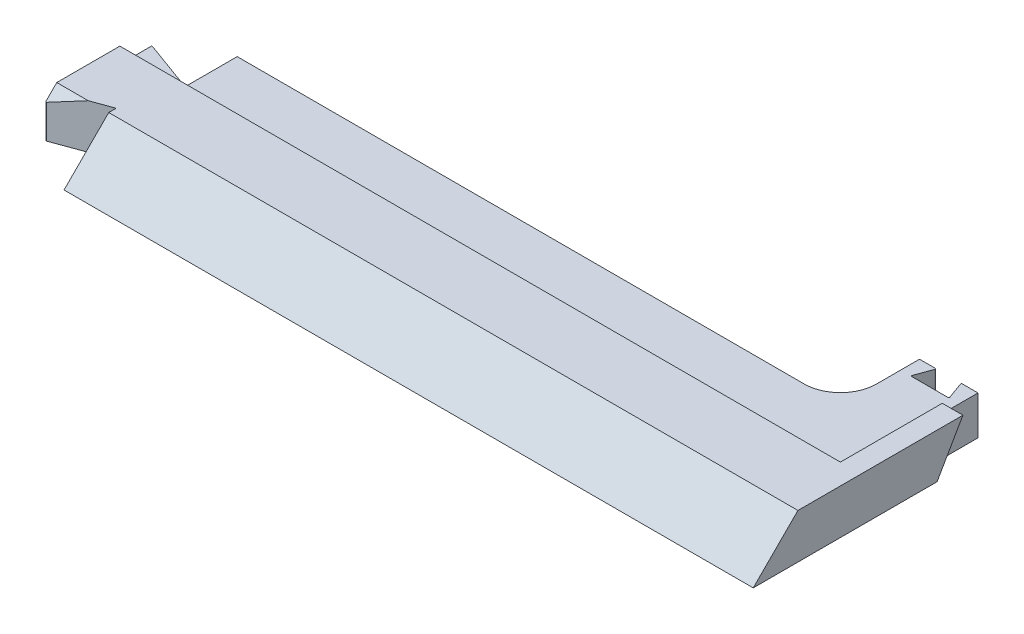
ISO-10303-21;
HEADER;
FILE_DESCRIPTION(('STEP AP214'),'2;1');
FILE_NAME('part.step','',(''),(''),'','','');
FILE_SCHEMA(('AUTOMOTIVE_DESIGN { 1 0 10303 214 1 1 1 1 }'));
ENDSEC;
DATA;
#1=APPLICATION_CONTEXT('core data for automotive mechanical design processes');
#2=APPLICATION_PROTOCOL_DEFINITION('international standard','automotive_design',2000,#1);
#3=PRODUCT_CONTEXT('',#1,'mechanical');
#4=PRODUCT('Part','Part','',(#3));
#5=PRODUCT_RELATED_PRODUCT_CATEGORY('part','',(#4));
#6=PRODUCT_DEFINITION_FORMATION('','',#4);
#7=PRODUCT_DEFINITION_CONTEXT('part definition',#1,'design');
#8=PRODUCT_DEFINITION('design','',#6,#7);
#9=PRODUCT_DEFINITION_SHAPE('','',#8);
#10=(LENGTH_UNIT() NAMED_UNIT(*) SI_UNIT(.MILLI.,.METRE.));
#11=(NAMED_UNIT(*) PLANE_ANGLE_UNIT() SI_UNIT($,.RADIAN.));
#12=(NAMED_UNIT(*) SI_UNIT($,.STERADIAN.) SOLID_ANGLE_UNIT());
#13=UNCERTAINTY_MEASURE_WITH_UNIT(LENGTH_MEASURE(1.E-05),#10,'distance_accuracy_value','');
#14=(GEOMETRIC_REPRESENTATION_CONTEXT(3) GLOBAL_UNCERTAINTY_ASSIGNED_CONTEXT((#13)) GLOBAL_UNIT_ASSIGNED_CONTEXT((#10,
#11,#12)) REPRESENTATION_CONTEXT('',''));
#15=CARTESIAN_POINT('',(0.,0.,0.));
#16=DIRECTION('',(0.,0.,1.));
#17=DIRECTION('',(1.,0.,0.));
#18=AXIS2_PLACEMENT_3D('',#15,#16,#17);
#19=CARTESIAN_POINT('',(-192.3375,0.,0.));
#20=DIRECTION('',(-1.,0.,0.));
#21=DIRECTION('',(0.,0.,1.));
#22=AXIS2_PLACEMENT_3D('',#19,#20,#21);
#23=PLANE('',#22);
#24=DIRECTION('',(0.,0.,1.));
#25=VECTOR('',#24,1.);
#26=CARTESIAN_POINT('',(-192.3375,0.,-330.275));
#27=LINE('',#26,#25);
#28=CARTESIAN_POINT('',(-192.3375,0.,-17.));
#29=VERTEX_POINT('',#28);
#30=CARTESIAN_POINT('',(-192.3375,0.,-2.11687960134838));
#31=VERTEX_POINT('',#30);
#32=EDGE_CURVE('E451',#29,#31,#27,.T.);
#33=ORIENTED_EDGE('',*,*,#32,.T.);
#34=DIRECTION('',(0.,1.,0.));
#35=VECTOR('',#34,1.);
#36=CARTESIAN_POINT('',(-192.3375,11.31,-2.1168796013484));
#37=LINE('',#36,#35);
#38=CARTESIAN_POINT('',(-192.3375,11.31,-2.11687960134838));
#39=VERTEX_POINT('',#38);
#40=EDGE_CURVE('E513',#31,#39,#37,.T.);
#41=ORIENTED_EDGE('',*,*,#40,.T.);
#42=DIRECTION('',(0.,0.,1.));
#43=VECTOR('',#42,1.);
#44=CARTESIAN_POINT('',(-192.3375,11.31,-330.275));
#45=LINE('',#44,#43);
#46=CARTESIAN_POINT('',(-192.3375,11.31,-17.));
#47=VERTEX_POINT('',#46);
#48=EDGE_CURVE('E328',#47,#39,#45,.T.);
#49=ORIENTED_EDGE('',*,*,#48,.F.);
#50=DIRECTION('',(0.,1.,0.));
#51=VECTOR('',#50,1.);
#52=CARTESIAN_POINT('',(-192.3375,2.9,-17.));
#53=LINE('',#52,#51);
#54=EDGE_CURVE('E323',#29,#47,#53,.T.);
#55=ORIENTED_EDGE('',*,*,#54,.F.);
#56=EDGE_LOOP('',(#33,#41,#49,#55));
#57=FACE_BOUND('',#56,.T.);
#58=ADVANCED_FACE('F46',(#57),#23,.T.);
#59=CARTESIAN_POINT('',(0.,0.,-40.));
#60=DIRECTION('',(0.,0.,1.));
#61=DIRECTION('',(1.,0.,0.));
#62=AXIS2_PLACEMENT_3D('',#59,#60,#61);
#63=PLANE('',#62);
#64=DIRECTION('',(1.,0.,0.));
#65=VECTOR('',#64,1.);
#66=CARTESIAN_POINT('',(-357.675,0.,-40.));
#67=LINE('',#66,#65);
#68=CARTESIAN_POINT('',(-4.61437039865159,0.,-40.));
#69=VERTEX_POINT('',#68);
#70=CARTESIAN_POINT('',(0.,0.,-40.));
#71=VERTEX_POINT('',#70);
#72=EDGE_CURVE('E327',#69,#71,#67,.T.);
#73=ORIENTED_EDGE('',*,*,#72,.F.);
#74=DIRECTION('',(0.,1.,0.));
#75=VECTOR('',#74,1.);
#76=CARTESIAN_POINT('',(-4.61437039865159,0.,-40.));
#77=LINE('',#76,#75);
#78=CARTESIAN_POINT('',(-4.61437039865159,11.31,-40.));
#79=VERTEX_POINT('',#78);
#80=EDGE_CURVE('E471',#69,#79,#77,.T.);
#81=ORIENTED_EDGE('',*,*,#80,.T.);
#82=DIRECTION('',(1.,0.,0.));
#83=VECTOR('',#82,1.);
#84=CARTESIAN_POINT('',(-357.675,11.31,-40.));
#85=LINE('',#84,#83);
#86=CARTESIAN_POINT('',(0.,11.31,-40.));
#87=VERTEX_POINT('',#86);
#88=EDGE_CURVE('E317',#79,#87,#85,.T.);
#89=ORIENTED_EDGE('',*,*,#88,.T.);
#90=DIRECTION('',(0.,1.,0.));
#91=VECTOR('',#90,1.);
#92=CARTESIAN_POINT('',(0.,2.9,-40.));
#93=LINE('',#92,#91);
#94=EDGE_CURVE('E321',#71,#87,#93,.T.);
#95=ORIENTED_EDGE('',*,*,#94,.F.);
#96=EDGE_LOOP('',(#73,#81,#89,#95));
#97=FACE_BOUND('',#96,.T.);
#98=ADVANCED_FACE('F658',(#97),#63,.F.);
#99=CARTESIAN_POINT('',(-17.,11.31,-40.));
#100=VERTEX_POINT('',#99);
#101=CARTESIAN_POINT('',(-12.3856296013484,11.31,-40.));
#102=VERTEX_POINT('',#101);
#103=EDGE_CURVE('E403',#100,#102,#85,.T.);
#104=ORIENTED_EDGE('',*,*,#103,.T.);
#105=DIRECTION('',(0.,1.,0.));
#106=VECTOR('',#105,1.);
#107=CARTESIAN_POINT('',(-12.3856296013484,0.,-40.));
#108=LINE('',#107,#106);
#109=CARTESIAN_POINT('',(-12.3856296013484,0.,-40.));
#110=VERTEX_POINT('',#109);
#111=EDGE_CURVE('E494',#102,#110,#108,.F.);
#112=ORIENTED_EDGE('',*,*,#111,.T.);
#113=CARTESIAN_POINT('',(-17.,0.,-40.));
#114=VERTEX_POINT('',#113);
#115=EDGE_CURVE('E333',#114,#110,#67,.T.);
#116=ORIENTED_EDGE('',*,*,#115,.F.);
#117=DIRECTION('',(0.,1.,0.));
#118=VECTOR('',#117,1.);
#119=CARTESIAN_POINT('',(-17.,2.9,-40.));
#120=LINE('',#119,#118);
#121=EDGE_CURVE('E322',#114,#100,#120,.T.);
#122=ORIENTED_EDGE('',*,*,#121,.T.);
#123=EDGE_LOOP('',(#104,#112,#116,#122));
#124=FACE_BOUND('',#123,.T.);
#125=ADVANCED_FACE('F622',(#124),#63,.F.);
#126=DIRECTION('',(0.,0.,1.));
#127=VECTOR('',#126,1.);
#128=CARTESIAN_POINT('',(-192.3375,15.9,0.));
#129=LINE('',#128,#127);
#130=CARTESIAN_POINT('',(-192.3375,15.9,18.4543796013485));
#131=VERTEX_POINT('',#130);
#132=CARTESIAN_POINT('',(-192.3375,15.9,20.3375000000002));
#133=VERTEX_POINT('',#132);
#134=EDGE_CURVE('E318',#131,#133,#129,.T.);
#135=ORIENTED_EDGE('',*,*,#134,.F.);
#136=DIRECTION('',(0.,1.,0.));
#137=VECTOR('',#136,1.);
#138=CARTESIAN_POINT('',(-192.3375,2.9,18.4543796013485));
#139=LINE('',#138,#137);
#140=CARTESIAN_POINT('',(-192.3375,2.9,18.4543796013485));
#141=VERTEX_POINT('',#140);
#142=EDGE_CURVE('E543',#131,#141,#139,.F.);
#143=ORIENTED_EDGE('',*,*,#142,.T.);
#144=DIRECTION('',(0.,0.,1.));
#145=VECTOR('',#144,1.);
#146=CARTESIAN_POINT('',(-192.3375,2.9,0.));
#147=LINE('',#146,#145);
#148=CARTESIAN_POINT('',(-192.3375,2.9,33.3375));
#149=VERTEX_POINT('',#148);
#150=EDGE_CURVE('E402',#141,#149,#147,.T.);
#151=ORIENTED_EDGE('',*,*,#150,.T.);
#152=DIRECTION('',(0.,0.707106781186551,-0.707106781186544));
#153=VECTOR('',#152,1.);
#154=CARTESIAN_POINT('',(-192.3375,2.89999999999999,33.3375000000001));
#155=LINE('',#154,#153);
#156=EDGE_CURVE('E407',#149,#133,#155,.T.);
#157=ORIENTED_EDGE('',*,*,#156,.T.);
#158=EDGE_LOOP('',(#135,#143,#151,#157));
#159=FACE_BOUND('',#158,.T.);
#160=ADVANCED_FACE('F695',(#159),#23,.T.);
#161=CARTESIAN_POINT('',(-27.5,2.9,-27.5));
#162=DIRECTION('',(0.,1.,0.));
#163=DIRECTION('',(0.,0.,1.));
#164=AXIS2_PLACEMENT_3D('',#161,#162,#163);
#165=CYLINDRICAL_SURFACE('',#164,10.5);
#166=CARTESIAN_POINT('',(-27.5,11.31,-27.5));
#167=DIRECTION('',(0.,1.,0.));
#168=DIRECTION('',(0.,0.,1.));
#169=AXIS2_PLACEMENT_3D('',#166,#167,#168);
#170=CIRCLE('',#169,10.5);
#171=CARTESIAN_POINT('',(-17.,11.31,-27.5));
#172=VERTEX_POINT('',#171);
#173=CARTESIAN_POINT('',(-27.5,11.31,-17.));
#174=VERTEX_POINT('',#173);
#175=EDGE_CURVE('E378',#172,#174,#170,.F.);
#176=ORIENTED_EDGE('',*,*,#175,.F.);
#177=DIRECTION('',(0.,-1.,0.));
#178=VECTOR('',#177,1.);
#179=CARTESIAN_POINT('',(-17.,2.9,-27.5));
#180=LINE('',#179,#178);
#181=CARTESIAN_POINT('',(-17.,0.,-27.5));
#182=VERTEX_POINT('',#181);
#183=EDGE_CURVE('E345',#182,#172,#180,.F.);
#184=ORIENTED_EDGE('',*,*,#183,.F.);
#185=CARTESIAN_POINT('',(-27.5,0.,-27.5));
#186=DIRECTION('',(0.,1.,0.));
#187=DIRECTION('',(0.,0.,1.));
#188=AXIS2_PLACEMENT_3D('',#185,#186,#187);
#189=CIRCLE('',#188,10.5);
#190=CARTESIAN_POINT('',(-27.5,0.,-17.));
#191=VERTEX_POINT('',#190);
#192=EDGE_CURVE('E342',#191,#182,#189,.T.);
#193=ORIENTED_EDGE('',*,*,#192,.F.);
#194=DIRECTION('',(0.,-1.,0.));
#195=VECTOR('',#194,1.);
#196=CARTESIAN_POINT('',(-27.5,0.,-17.));
#197=LINE('',#196,#195);
#198=EDGE_CURVE('E349',#174,#191,#197,.T.);
#199=ORIENTED_EDGE('',*,*,#198,.F.);
#200=EDGE_LOOP('',(#176,#184,#193,#199));
#201=FACE_BOUND('',#200,.T.);
#202=ADVANCED_FACE('F616',(#201),#165,.F.);
#203=CARTESIAN_POINT('',(-17.,2.9,-17.));
#204=DIRECTION('',(-1.,0.,0.));
#205=DIRECTION('',(0.,0.,1.));
#206=AXIS2_PLACEMENT_3D('',#203,#204,#205);
#207=PLANE('',#206);
#208=ORIENTED_EDGE('',*,*,#121,.F.);
#209=DIRECTION('',(0.,0.,-1.));
#210=VECTOR('',#209,1.);
#211=CARTESIAN_POINT('',(-17.,0.,-17.));
#212=LINE('',#211,#210);
#213=EDGE_CURVE('E260',#182,#114,#212,.T.);
#214=ORIENTED_EDGE('',*,*,#213,.F.);
#215=ORIENTED_EDGE('',*,*,#183,.T.);
#216=DIRECTION('',(0.,0.,-1.));
#217=VECTOR('',#216,1.);
#218=CARTESIAN_POINT('',(-17.,11.31,-17.));
#219=LINE('',#218,#217);
#220=EDGE_CURVE('E414',#172,#100,#219,.T.);
#221=ORIENTED_EDGE('',*,*,#220,.T.);
#222=EDGE_LOOP('',(#208,#214,#215,#221));
#223=FACE_BOUND('',#222,.T.);
#224=ADVANCED_FACE('F620',(#223),#207,.T.);
#225=CARTESIAN_POINT('',(0.,2.9,0.));
#226=DIRECTION('',(-1.,0.,0.));
#227=DIRECTION('',(0.,0.,1.));
#228=AXIS2_PLACEMENT_3D('',#225,#226,#227);
#229=PLANE('',#228);
#230=DIRECTION('',(0.,0.,-1.));
#231=VECTOR('',#230,1.);
#232=CARTESIAN_POINT('',(0.,0.,0.));
#233=LINE('',#232,#231);
#234=CARTESIAN_POINT('',(0.,0.,0.));
#235=VERTEX_POINT('',#234);
#236=EDGE_CURVE('E255',#235,#71,#233,.T.);
#237=ORIENTED_EDGE('',*,*,#236,.T.);
#238=ORIENTED_EDGE('',*,*,#94,.T.);
#239=DIRECTION('',(0.,0.,-1.));
#240=VECTOR('',#239,1.);
#241=CARTESIAN_POINT('',(0.,11.31,0.));
#242=LINE('',#241,#240);
#243=CARTESIAN_POINT('',(0.,11.31,-24.964825109489));
#244=VERTEX_POINT('',#243);
#245=EDGE_CURVE('E388',#244,#87,#242,.T.);
#246=ORIENTED_EDGE('',*,*,#245,.F.);
#247=DIRECTION('',(0.,0.866025403784436,-0.500000000000004));
#248=VECTOR('',#247,1.);
#249=CARTESIAN_POINT('',(0.,2.9,-20.1093093456042));
#250=LINE('',#249,#248);
#251=CARTESIAN_POINT('',(0.,2.9,-20.1093093456042));
#252=VERTEX_POINT('',#251);
#253=EDGE_CURVE('E360',#252,#244,#250,.T.);
#254=ORIENTED_EDGE('',*,*,#253,.F.);
#255=DIRECTION('',(0.,0.,-1.));
#256=VECTOR('',#255,1.);
#257=CARTESIAN_POINT('',(0.,2.9,0.));
#258=LINE('',#257,#256);
#259=CARTESIAN_POINT('',(0.,2.9,0.));
#260=VERTEX_POINT('',#259);
#261=EDGE_CURVE('E356',#260,#252,#258,.T.);
#262=ORIENTED_EDGE('',*,*,#261,.F.);
#263=DIRECTION('',(0.,-1.,0.));
#264=VECTOR('',#263,1.);
#265=CARTESIAN_POINT('',(0.,2.9,0.));
#266=LINE('',#265,#264);
#267=EDGE_CURVE('E353',#260,#235,#266,.T.);
#268=ORIENTED_EDGE('',*,*,#267,.T.);
#269=EDGE_LOOP('',(#237,#238,#246,#254,#262,#268));
#270=FACE_BOUND('',#269,.T.);
#271=ADVANCED_FACE('F664',(#270),#229,.F.);
#272=CARTESIAN_POINT('',(0.,2.9,-20.1093093456042));
#273=DIRECTION('',(0.,-0.500000000000004,-0.866025403784436));
#274=DIRECTION('',(0.,0.866025403784436,-0.500000000000004));
#275=AXIS2_PLACEMENT_3D('',#272,#273,#274);
#276=PLANE('',#275);
#277=DIRECTION('',(0.,-0.866025403784436,0.500000000000004));
#278=VECTOR('',#277,1.);
#279=CARTESIAN_POINT('',(2.,2.9,-20.1093093456042));
#280=LINE('',#279,#278);
#281=CARTESIAN_POINT('',(2.,15.9,-27.6148628450694));
#282=VERTEX_POINT('',#281);
#283=CARTESIAN_POINT('',(2.,11.31,-24.964825109489));
#284=VERTEX_POINT('',#283);
#285=EDGE_CURVE('E334',#282,#284,#280,.T.);
#286=ORIENTED_EDGE('',*,*,#285,.F.);
#287=DIRECTION('',(1.,0.,0.));
#288=VECTOR('',#287,1.);
#289=CARTESIAN_POINT('',(0.,15.9,-27.6148628450694));
#290=LINE('',#289,#288);
#291=CARTESIAN_POINT('',(8.00000000000006,15.9,-27.6148628450694));
#292=VERTEX_POINT('',#291);
#293=EDGE_CURVE('E357',#282,#292,#290,.T.);
#294=ORIENTED_EDGE('',*,*,#293,.T.);
#295=DIRECTION('',(0.,0.866025403784436,-0.500000000000004));
#296=VECTOR('',#295,1.);
#297=CARTESIAN_POINT('',(8.00000000000006,2.9,-20.1093093456042));
#298=LINE('',#297,#296);
#299=CARTESIAN_POINT('',(8.00000000000006,2.9,-20.1093093456042));
#300=VERTEX_POINT('',#299);
#301=EDGE_CURVE('E366',#300,#292,#298,.T.);
#302=ORIENTED_EDGE('',*,*,#301,.F.);
#303=DIRECTION('',(1.,0.,0.));
#304=VECTOR('',#303,1.);
#305=CARTESIAN_POINT('',(0.,2.9,-20.1093093456042));
#306=LINE('',#305,#304);
#307=EDGE_CURVE('E361',#252,#300,#306,.T.);
#308=ORIENTED_EDGE('',*,*,#307,.F.);
#309=ORIENTED_EDGE('',*,*,#253,.T.);
#310=DIRECTION('',(1.,0.,0.));
#311=VECTOR('',#310,1.);
#312=CARTESIAN_POINT('',(0.,11.31,-24.964825109489));
#313=LINE('',#312,#311);
#314=EDGE_CURVE('E338',#244,#284,#313,.T.);
#315=ORIENTED_EDGE('',*,*,#314,.T.);
#316=EDGE_LOOP('',(#286,#294,#302,#308,#309,#315));
#317=FACE_BOUND('',#316,.T.);
#318=ADVANCED_FACE('F685',(#317),#276,.T.);
#319=CARTESIAN_POINT('',(-367.675,2.9,-17.));
#320=DIRECTION('',(0.,0.,-1.));
#321=DIRECTION('',(-1.,0.,0.));
#322=AXIS2_PLACEMENT_3D('',#319,#320,#321);
#323=PLANE('',#322);
#324=DIRECTION('',(1.,0.,0.));
#325=VECTOR('',#324,1.);
#326=CARTESIAN_POINT('',(-367.675,0.,-17.));
#327=LINE('',#326,#325);
#328=EDGE_CURVE('E427',#29,#191,#327,.T.);
#329=ORIENTED_EDGE('',*,*,#328,.F.);
#330=ORIENTED_EDGE('',*,*,#54,.T.);
#331=DIRECTION('',(1.,0.,0.));
#332=VECTOR('',#331,1.);
#333=CARTESIAN_POINT('',(-367.675,11.31,-17.));
#334=LINE('',#333,#332);
#335=EDGE_CURVE('E382',#47,#174,#334,.T.);
#336=ORIENTED_EDGE('',*,*,#335,.T.);
#337=ORIENTED_EDGE('',*,*,#198,.T.);
#338=EDGE_LOOP('',(#329,#330,#336,#337));
#339=FACE_BOUND('',#338,.T.);
#340=ADVANCED_FACE('F610',(#339),#323,.T.);
#341=CARTESIAN_POINT('',(-357.675,11.31,-330.275));
#342=DIRECTION('',(0.,1.,0.));
#343=DIRECTION('',(0.,0.,1.));
#344=AXIS2_PLACEMENT_3D('',#341,#342,#343);
#345=PLANE('',#344);
#346=DIRECTION('',(-0.939692620785907,0.,-0.342020143325672));
#347=VECTOR('',#346,1.);
#348=CARTESIAN_POINT('',(-207.448625807,11.31,-7.33124999999996));
#349=LINE('',#348,#347);
#350=CARTESIAN_POINT('',(-192.605904028665,11.31,-1.92894107719122));
#351=VERTEX_POINT('',#350);
#352=CARTESIAN_POINT('',(-207.180221778335,11.31,-7.23355892280871));
#353=VERTEX_POINT('',#352);
#354=EDGE_CURVE('E294',#351,#353,#349,.T.);
#355=ORIENTED_EDGE('',*,*,#354,.T.);
#356=CARTESIAN_POINT('',(-207.248625807,11.31,-7.04562039865153));
#357=DIRECTION('',(0.,1.,0.));
#358=DIRECTION('',(0.,0.,1.));
#359=AXIS2_PLACEMENT_3D('',#356,#357,#358);
#360=CIRCLE('',#359,0.2);
#361=CARTESIAN_POINT('',(-207.448625807,11.31,-7.04562039865153));
#362=VERTEX_POINT('',#361);
#363=EDGE_CURVE('E524',#353,#362,#360,.T.);
#364=ORIENTED_EDGE('',*,*,#363,.T.);
#365=DIRECTION('',(0.,0.,-1.));
#366=VECTOR('',#365,1.);
#367=CARTESIAN_POINT('',(-207.448625807,11.31,2.00000000000008));
#368=LINE('',#367,#366);
#369=CARTESIAN_POINT('',(-207.448625807,11.31,2.00000000000008));
#370=VERTEX_POINT('',#369);
#371=EDGE_CURVE('E588',#370,#362,#368,.T.);
#372=ORIENTED_EDGE('',*,*,#371,.F.);
#373=DIRECTION('',(-1.,0.,0.));
#374=VECTOR('',#373,1.);
#375=CARTESIAN_POINT('',(0.,11.31,2.00000000000006));
#376=LINE('',#375,#374);
#377=CARTESIAN_POINT('',(2.,11.31,2.00000000000006));
#378=VERTEX_POINT('',#377);
#379=EDGE_CURVE('E389',#378,#370,#376,.T.);
#380=ORIENTED_EDGE('',*,*,#379,.F.);
#381=DIRECTION('',(0.,0.,1.));
#382=VECTOR('',#381,1.);
#383=CARTESIAN_POINT('',(2.,11.31,0.));
#384=LINE('',#383,#382);
#385=EDGE_CURVE('E387',#284,#378,#384,.T.);
#386=ORIENTED_EDGE('',*,*,#385,.F.);
#387=ORIENTED_EDGE('',*,*,#314,.F.);
#388=ORIENTED_EDGE('',*,*,#245,.T.);
#389=ORIENTED_EDGE('',*,*,#88,.F.);
#390=CARTESIAN_POINT('',(-4.61437039865159,11.31,-39.8));
#391=DIRECTION('',(0.,1.,0.));
#392=DIRECTION('',(0.,0.,1.));
#393=AXIS2_PLACEMENT_3D('',#390,#391,#392);
#394=CIRCLE('',#393,0.2);
#395=CARTESIAN_POINT('',(-4.80230892280875,11.31,-39.7315959713349));
#396=VERTEX_POINT('',#395);
#397=EDGE_CURVE('E478',#79,#396,#394,.T.);
#398=ORIENTED_EDGE('',*,*,#397,.T.);
#399=DIRECTION('',(-0.342020143325666,0.,-0.939692620785909));
#400=VECTOR('',#399,1.);
#401=CARTESIAN_POINT('',(-139.45942249023,11.31,-409.698974866765));
#402=LINE('',#401,#400);
#403=CARTESIAN_POINT('',(-2.99769107719122,11.31,-34.7734491897558));
#404=VERTEX_POINT('',#403);
#405=EDGE_CURVE('E313',#404,#396,#402,.T.);
#406=ORIENTED_EDGE('',*,*,#405,.F.);
#407=CARTESIAN_POINT('',(-3.18562960134843,11.31,-34.7050451610907));
#408=DIRECTION('',(0.,1.,0.));
#409=DIRECTION('',(0.,0.,1.));
#410=AXIS2_PLACEMENT_3D('',#407,#408,#409);
#411=CIRCLE('',#410,0.2);
#412=CARTESIAN_POINT('',(-3.18562960134844,11.31,-34.5050451610906));
#413=VERTEX_POINT('',#412);
#414=EDGE_CURVE('E497',#404,#413,#411,.F.);
#415=ORIENTED_EDGE('',*,*,#414,.T.);
#416=DIRECTION('',(1.,0.,0.));
#417=VECTOR('',#416,1.);
#418=CARTESIAN_POINT('',(-357.675,11.31,-34.5050451610906));
#419=LINE('',#418,#417);
#420=CARTESIAN_POINT('',(-13.8143703986516,11.31,-34.5050451610906));
#421=VERTEX_POINT('',#420);
#422=EDGE_CURVE('E309',#421,#413,#419,.T.);
#423=ORIENTED_EDGE('',*,*,#422,.F.);
#424=CARTESIAN_POINT('',(-13.8143703986516,11.31,-34.7050451610907));
#425=DIRECTION('',(0.,1.,0.));
#426=DIRECTION('',(0.,0.,1.));
#427=AXIS2_PLACEMENT_3D('',#424,#425,#426);
#428=CIRCLE('',#427,0.2);
#429=CARTESIAN_POINT('',(-14.0023089228087,11.31,-34.7734491897557));
#430=VERTEX_POINT('',#429);
#431=EDGE_CURVE('E503',#421,#430,#428,.F.);
#432=ORIENTED_EDGE('',*,*,#431,.T.);
#433=DIRECTION('',(-0.342020143325666,0.,0.93969262078591));
#434=VECTOR('',#433,1.);
#435=CARTESIAN_POINT('',(40.7679909163006,11.31,-185.253611254469));
#436=LINE('',#435,#434);
#437=CARTESIAN_POINT('',(-12.1976910771912,11.31,-39.7315959713348));
#438=VERTEX_POINT('',#437);
#439=EDGE_CURVE('E305',#438,#430,#436,.T.);
#440=ORIENTED_EDGE('',*,*,#439,.F.);
#441=CARTESIAN_POINT('',(-12.3856296013484,11.31,-39.8));
#442=DIRECTION('',(0.,1.,0.));
#443=DIRECTION('',(0.,0.,1.));
#444=AXIS2_PLACEMENT_3D('',#441,#442,#443);
#445=CIRCLE('',#444,0.2);
#446=EDGE_CURVE('E475',#438,#102,#445,.T.);
#447=ORIENTED_EDGE('',*,*,#446,.T.);
#448=ORIENTED_EDGE('',*,*,#103,.F.);
#449=ORIENTED_EDGE('',*,*,#220,.F.);
#450=ORIENTED_EDGE('',*,*,#175,.T.);
#451=ORIENTED_EDGE('',*,*,#335,.F.);
#452=ORIENTED_EDGE('',*,*,#48,.T.);
#453=CARTESIAN_POINT('',(-192.5375,11.31,-2.1168796013484));
#454=DIRECTION('',(0.,1.,0.));
#455=DIRECTION('',(0.,0.,1.));
#456=AXIS2_PLACEMENT_3D('',#453,#454,#455);
#457=CIRCLE('',#456,0.2);
#458=EDGE_CURVE('E549',#39,#351,#457,.F.);
#459=ORIENTED_EDGE('',*,*,#458,.T.);
#460=EDGE_LOOP('',(#355,#364,#372,#380,#386,#387,#388,#389,#398,#406,#415,#423,#432,#440,#447,
#448,#449,#450,#451,#452,#459));
#461=FACE_BOUND('',#460,.T.);
#462=ADVANCED_FACE('F594',(#461),#345,.T.);
#463=CARTESIAN_POINT('',(2.,15.900012,0.));
#464=DIRECTION('',(1.,0.,0.));
#465=DIRECTION('',(0.,0.,-1.));
#466=AXIS2_PLACEMENT_3D('',#463,#464,#465);
#467=PLANE('',#466);
#468=DIRECTION('',(0.,0.,-1.));
#469=VECTOR('',#468,1.);
#470=CARTESIAN_POINT('',(2.,15.9,0.));
#471=LINE('',#470,#469);
#472=CARTESIAN_POINT('',(2.,15.9,2.00000000000006));
#473=VERTEX_POINT('',#472);
#474=EDGE_CURVE('E383',#473,#282,#471,.T.);
#475=ORIENTED_EDGE('',*,*,#474,.T.);
#476=ORIENTED_EDGE('',*,*,#285,.T.);
#477=ORIENTED_EDGE('',*,*,#385,.T.);
#478=DIRECTION('',(0.,-1.,0.));
#479=VECTOR('',#478,1.);
#480=CARTESIAN_POINT('',(2.,15.900012,2.00000000000006));
#481=LINE('',#480,#479);
#482=EDGE_CURVE('E384',#473,#378,#481,.T.);
#483=ORIENTED_EDGE('',*,*,#482,.F.);
#484=EDGE_LOOP('',(#475,#476,#477,#483));
#485=FACE_BOUND('',#484,.T.);
#486=ADVANCED_FACE('F681',(#485),#467,.F.);
#487=CARTESIAN_POINT('',(0.,15.9,0.));
#488=DIRECTION('',(0.,1.,0.));
#489=DIRECTION('',(0.,0.,1.));
#490=AXIS2_PLACEMENT_3D('',#487,#488,#489);
#491=PLANE('',#490);
#492=DIRECTION('',(1.,0.,0.));
#493=VECTOR('',#492,1.);
#494=CARTESIAN_POINT('',(-207.448625807,15.9,20.3375000000002));
#495=LINE('',#494,#493);
#496=CARTESIAN_POINT('',(-207.448625807,15.9,20.3375000000002));
#497=VERTEX_POINT('',#496);
#498=CARTESIAN_POINT('',(-198.296091653443,15.9,20.3375000000002));
#499=VERTEX_POINT('',#498);
#500=EDGE_CURVE('E571',#497,#499,#495,.T.);
#501=ORIENTED_EDGE('',*,*,#500,.T.);
#502=DIRECTION('',(0.939692620785907,0.,-0.342020143325672));
#503=VECTOR('',#502,1.);
#504=CARTESIAN_POINT('',(-192.3375,15.9,18.16875));
#505=LINE('',#504,#503);
#506=CARTESIAN_POINT('',(-192.605904028665,15.9,18.2664410771913));
#507=VERTEX_POINT('',#506);
#508=EDGE_CURVE('E291',#499,#507,#505,.T.);
#509=ORIENTED_EDGE('',*,*,#508,.T.);
#510=CARTESIAN_POINT('',(-192.5375,15.9,18.4543796013485));
#511=DIRECTION('',(0.,1.,0.));
#512=DIRECTION('',(0.,0.,1.));
#513=AXIS2_PLACEMENT_3D('',#510,#511,#512);
#514=CIRCLE('',#513,0.2);
#515=EDGE_CURVE('E69',#507,#131,#514,.F.);
#516=ORIENTED_EDGE('',*,*,#515,.T.);
#517=ORIENTED_EDGE('',*,*,#134,.T.);
#518=DIRECTION('',(1.,0.,0.));
#519=VECTOR('',#518,1.);
#520=CARTESIAN_POINT('',(-392.675,15.9,20.3375000000002));
#521=LINE('',#520,#519);
#522=CARTESIAN_POINT('',(8.00000000000006,15.9,20.3375000000002));
#523=VERTEX_POINT('',#522);
#524=EDGE_CURVE('E377',#133,#523,#521,.T.);
#525=ORIENTED_EDGE('',*,*,#524,.T.);
#526=DIRECTION('',(0.,0.,1.));
#527=VECTOR('',#526,1.);
#528=CARTESIAN_POINT('',(8.00000000000006,15.9,0.));
#529=LINE('',#528,#527);
#530=EDGE_CURVE('E423',#292,#523,#529,.T.);
#531=ORIENTED_EDGE('',*,*,#530,.F.);
#532=ORIENTED_EDGE('',*,*,#293,.F.);
#533=ORIENTED_EDGE('',*,*,#474,.F.);
#534=DIRECTION('',(1.,0.,0.));
#535=VECTOR('',#534,1.);
#536=CARTESIAN_POINT('',(0.,15.9,2.00000000000006));
#537=LINE('',#536,#535);
#538=CARTESIAN_POINT('',(-207.448625807,15.9,2.00000000000008));
#539=VERTEX_POINT('',#538);
#540=EDGE_CURVE('E332',#539,#473,#537,.T.);
#541=ORIENTED_EDGE('',*,*,#540,.F.);
#542=DIRECTION('',(0.,0.,1.));
#543=VECTOR('',#542,1.);
#544=CARTESIAN_POINT('',(-207.448625807,15.9,23.66875));
#545=LINE('',#544,#543);
#546=EDGE_CURVE('E287',#539,#497,#545,.T.);
#547=ORIENTED_EDGE('',*,*,#546,.T.);
#548=EDGE_LOOP('',(#501,#509,#516,#517,#525,#531,#532,#533,#541,#547));
#549=FACE_BOUND('',#548,.T.);
#550=ADVANCED_FACE('F570',(#549),#491,.T.);
#551=CARTESIAN_POINT('',(0.,15.900012,2.00000000000006));
#552=DIRECTION('',(0.,0.,1.));
#553=DIRECTION('',(1.,0.,0.));
#554=AXIS2_PLACEMENT_3D('',#551,#552,#553);
#555=PLANE('',#554);
#556=ORIENTED_EDGE('',*,*,#379,.T.);
#557=DIRECTION('',(0.,-1.,0.));
#558=VECTOR('',#557,1.);
#559=CARTESIAN_POINT('',(-207.448625807,11.31,2.00000000000008));
#560=LINE('',#559,#558);
#561=EDGE_CURVE('E580',#539,#370,#560,.T.);
#562=ORIENTED_EDGE('',*,*,#561,.F.);
#563=ORIENTED_EDGE('',*,*,#540,.T.);
#564=ORIENTED_EDGE('',*,*,#482,.T.);
#565=EDGE_LOOP('',(#556,#562,#563,#564));
#566=FACE_BOUND('',#565,.T.);
#567=ADVANCED_FACE('F676',(#566),#555,.F.);
#568=CARTESIAN_POINT('',(8.00000000000006,15.9,0.));
#569=DIRECTION('',(1.,0.,0.));
#570=DIRECTION('',(0.,0.,-1.));
#571=AXIS2_PLACEMENT_3D('',#568,#569,#570);
#572=PLANE('',#571);
#573=DIRECTION('',(0.,0.707106781186551,-0.707106781186544));
#574=VECTOR('',#573,1.);
#575=CARTESIAN_POINT('',(8.00000000000006,26.0687500000001,10.1687500000002));
#576=LINE('',#575,#574);
#577=CARTESIAN_POINT('',(8.00000000000006,2.9,33.3375));
#578=VERTEX_POINT('',#577);
#579=EDGE_CURVE('E370',#578,#523,#576,.T.);
#580=ORIENTED_EDGE('',*,*,#579,.F.);
#581=DIRECTION('',(0.,0.,1.));
#582=VECTOR('',#581,1.);
#583=CARTESIAN_POINT('',(8.00000000000006,2.9,0.));
#584=LINE('',#583,#582);
#585=EDGE_CURVE('E365',#300,#578,#584,.T.);
#586=ORIENTED_EDGE('',*,*,#585,.F.);
#587=ORIENTED_EDGE('',*,*,#301,.T.);
#588=ORIENTED_EDGE('',*,*,#530,.T.);
#589=EDGE_LOOP('',(#580,#586,#587,#588));
#590=FACE_BOUND('',#589,.T.);
#591=ADVANCED_FACE('F689',(#590),#572,.T.);
#592=CARTESIAN_POINT('',(0.,2.9,0.));
#593=DIRECTION('',(0.,1.,0.));
#594=DIRECTION('',(0.,0.,1.));
#595=AXIS2_PLACEMENT_3D('',#592,#593,#594);
#596=PLANE('',#595);
#597=ORIENTED_EDGE('',*,*,#585,.T.);
#598=DIRECTION('',(1.,0.,0.));
#599=VECTOR('',#598,1.);
#600=CARTESIAN_POINT('',(0.,2.9,33.3375));
#601=LINE('',#600,#599);
#602=EDGE_CURVE('E422',#149,#578,#601,.T.);
#603=ORIENTED_EDGE('',*,*,#602,.F.);
#604=ORIENTED_EDGE('',*,*,#150,.F.);
#605=CARTESIAN_POINT('',(-192.5375,2.9,18.4543796013485));
#606=DIRECTION('',(0.,1.,0.));
#607=DIRECTION('',(0.,0.,1.));
#608=AXIS2_PLACEMENT_3D('',#605,#606,#607);
#609=CIRCLE('',#608,0.2);
#610=CARTESIAN_POINT('',(-192.605904028665,2.9,18.2664410771913));
#611=VERTEX_POINT('',#610);
#612=EDGE_CURVE('E55',#141,#611,#609,.T.);
#613=ORIENTED_EDGE('',*,*,#612,.T.);
#614=DIRECTION('',(-0.939692620785907,0.,0.342020143325672));
#615=VECTOR('',#614,1.);
#616=CARTESIAN_POINT('',(-192.3375,2.9,18.16875));
#617=LINE('',#616,#615);
#618=CARTESIAN_POINT('',(-207.180221778335,2.9,23.5710589228088));
#619=VERTEX_POINT('',#618);
#620=EDGE_CURVE('E61',#611,#619,#617,.T.);
#621=ORIENTED_EDGE('',*,*,#620,.T.);
#622=CARTESIAN_POINT('',(-207.248625807,2.9,23.3831203986516));
#623=DIRECTION('',(0.,1.,0.));
#624=DIRECTION('',(0.,0.,1.));
#625=AXIS2_PLACEMENT_3D('',#622,#623,#624);
#626=CIRCLE('',#625,0.2);
#627=CARTESIAN_POINT('',(-207.448625807,2.9,23.3831203986516));
#628=VERTEX_POINT('',#627);
#629=EDGE_CURVE('E11',#619,#628,#626,.F.);
#630=ORIENTED_EDGE('',*,*,#629,.T.);
#631=DIRECTION('',(0.,0.,1.));
#632=VECTOR('',#631,1.);
#633=CARTESIAN_POINT('',(-207.448625807,2.9,23.5831203986516));
#634=LINE('',#633,#632);
#635=CARTESIAN_POINT('',(-207.448625807,2.9,0.));
#636=VERTEX_POINT('',#635);
#637=EDGE_CURVE('E270',#636,#628,#634,.T.);
#638=ORIENTED_EDGE('',*,*,#637,.F.);
#639=DIRECTION('',(1.,0.,0.));
#640=VECTOR('',#639,1.);
#641=CARTESIAN_POINT('',(0.,2.9,0.));
#642=LINE('',#641,#640);
#643=EDGE_CURVE('E265',#636,#260,#642,.T.);
#644=ORIENTED_EDGE('',*,*,#643,.T.);
#645=ORIENTED_EDGE('',*,*,#261,.T.);
#646=ORIENTED_EDGE('',*,*,#307,.T.);
#647=EDGE_LOOP('',(#597,#603,#604,#613,#621,#630,#638,#644,#645,#646));
#648=FACE_BOUND('',#647,.T.);
#649=ADVANCED_FACE('F560',(#648),#596,.F.);
#650=CARTESIAN_POINT('',(-392.675,2.9,33.3375000000001));
#651=DIRECTION('',(0.,-0.707106781186544,-0.707106781186551));
#652=DIRECTION('',(0.,0.707106781186551,-0.707106781186544));
#653=AXIS2_PLACEMENT_3D('',#650,#651,#652);
#654=PLANE('',#653);
#655=ORIENTED_EDGE('',*,*,#156,.F.);
#656=ORIENTED_EDGE('',*,*,#602,.T.);
#657=ORIENTED_EDGE('',*,*,#579,.T.);
#658=ORIENTED_EDGE('',*,*,#524,.F.);
#659=EDGE_LOOP('',(#655,#656,#657,#658));
#660=FACE_BOUND('',#659,.T.);
#661=ADVANCED_FACE('F693',(#660),#654,.F.);
#662=CARTESIAN_POINT('',(-357.675,0.,-330.275));
#663=DIRECTION('',(0.,1.,0.));
#664=DIRECTION('',(0.,0.,1.));
#665=AXIS2_PLACEMENT_3D('',#662,#663,#664);
#666=PLANE('',#665);
#667=DIRECTION('',(1.,0.,0.));
#668=VECTOR('',#667,1.);
#669=CARTESIAN_POINT('',(0.,0.,0.));
#670=LINE('',#669,#668);
#671=CARTESIAN_POINT('',(-207.448625807,0.,0.));
#672=VERTEX_POINT('',#671);
#673=EDGE_CURVE('E248',#672,#235,#670,.T.);
#674=ORIENTED_EDGE('',*,*,#673,.F.);
#675=DIRECTION('',(0.,0.,-1.));
#676=VECTOR('',#675,1.);
#677=CARTESIAN_POINT('',(-207.448625807,0.,23.66875));
#678=LINE('',#677,#676);
#679=CARTESIAN_POINT('',(-207.448625807,0.,-7.04562039865153));
#680=VERTEX_POINT('',#679);
#681=EDGE_CURVE('E252',#672,#680,#678,.T.);
#682=ORIENTED_EDGE('',*,*,#681,.T.);
#683=CARTESIAN_POINT('',(-207.248625807,0.,-7.04562039865153));
#684=DIRECTION('',(0.,1.,0.));
#685=DIRECTION('',(0.,0.,1.));
#686=AXIS2_PLACEMENT_3D('',#683,#684,#685);
#687=CIRCLE('',#686,0.2);
#688=CARTESIAN_POINT('',(-207.180221778335,0.,-7.23355892280871));
#689=VERTEX_POINT('',#688);
#690=EDGE_CURVE('E532',#680,#689,#687,.F.);
#691=ORIENTED_EDGE('',*,*,#690,.T.);
#692=DIRECTION('',(0.939692620785907,0.,0.342020143325672));
#693=VECTOR('',#692,1.);
#694=CARTESIAN_POINT('',(-207.448625807,0.,-7.33124999999996));
#695=LINE('',#694,#693);
#696=CARTESIAN_POINT('',(-192.605904028665,0.,-1.92894107719122));
#697=VERTEX_POINT('',#696);
#698=EDGE_CURVE('E279',#689,#697,#695,.T.);
#699=ORIENTED_EDGE('',*,*,#698,.T.);
#700=CARTESIAN_POINT('',(-192.5375,0.,-2.1168796013484));
#701=DIRECTION('',(0.,1.,0.));
#702=DIRECTION('',(0.,0.,1.));
#703=AXIS2_PLACEMENT_3D('',#700,#701,#702);
#704=CIRCLE('',#703,0.2);
#705=EDGE_CURVE('E552',#697,#31,#704,.T.);
#706=ORIENTED_EDGE('',*,*,#705,.T.);
#707=ORIENTED_EDGE('',*,*,#32,.F.);
#708=ORIENTED_EDGE('',*,*,#328,.T.);
#709=ORIENTED_EDGE('',*,*,#192,.T.);
#710=ORIENTED_EDGE('',*,*,#213,.T.);
#711=ORIENTED_EDGE('',*,*,#115,.T.);
#712=CARTESIAN_POINT('',(-12.3856296013484,0.,-39.8));
#713=DIRECTION('',(0.,1.,0.));
#714=DIRECTION('',(0.,0.,1.));
#715=AXIS2_PLACEMENT_3D('',#712,#713,#714);
#716=CIRCLE('',#715,0.2);
#717=CARTESIAN_POINT('',(-12.1976910771912,0.,-39.7315959713349));
#718=VERTEX_POINT('',#717);
#719=EDGE_CURVE('E481',#110,#718,#716,.F.);
#720=ORIENTED_EDGE('',*,*,#719,.T.);
#721=DIRECTION('',(-0.342020143325666,0.,0.93969262078591));
#722=VECTOR('',#721,1.);
#723=CARTESIAN_POINT('',(-14.1,0.,-34.5050451610907));
#724=LINE('',#723,#722);
#725=CARTESIAN_POINT('',(-14.0023089228088,0.,-34.7734491897558));
#726=VERTEX_POINT('',#725);
#727=EDGE_CURVE('E278',#718,#726,#724,.T.);
#728=ORIENTED_EDGE('',*,*,#727,.T.);
#729=CARTESIAN_POINT('',(-13.8143703986516,0.,-34.7050451610907));
#730=DIRECTION('',(0.,1.,0.));
#731=DIRECTION('',(0.,0.,1.));
#732=AXIS2_PLACEMENT_3D('',#729,#730,#731);
#733=CIRCLE('',#732,0.2);
#734=CARTESIAN_POINT('',(-13.8143703986516,0.,-34.5050451610907));
#735=VERTEX_POINT('',#734);
#736=EDGE_CURVE('E506',#726,#735,#733,.T.);
#737=ORIENTED_EDGE('',*,*,#736,.T.);
#738=DIRECTION('',(1.,0.,0.));
#739=VECTOR('',#738,1.);
#740=CARTESIAN_POINT('',(-2.90000000000001,0.,-34.5050451610907));
#741=LINE('',#740,#739);
#742=CARTESIAN_POINT('',(-3.18562960134843,0.,-34.5050451610907));
#743=VERTEX_POINT('',#742);
#744=EDGE_CURVE('E284',#735,#743,#741,.T.);
#745=ORIENTED_EDGE('',*,*,#744,.T.);
#746=CARTESIAN_POINT('',(-3.18562960134843,0.,-34.7050451610907));
#747=DIRECTION('',(0.,1.,0.));
#748=DIRECTION('',(0.,0.,1.));
#749=AXIS2_PLACEMENT_3D('',#746,#747,#748);
#750=CIRCLE('',#749,0.2);
#751=CARTESIAN_POINT('',(-2.99769107719125,0.,-34.7734491897558));
#752=VERTEX_POINT('',#751);
#753=EDGE_CURVE('E500',#743,#752,#750,.T.);
#754=ORIENTED_EDGE('',*,*,#753,.T.);
#755=DIRECTION('',(-0.342020143325666,0.,-0.939692620785909));
#756=VECTOR('',#755,1.);
#757=CARTESIAN_POINT('',(-4.90000000000001,0.,-40.));
#758=LINE('',#757,#756);
#759=CARTESIAN_POINT('',(-4.80230892280878,0.,-39.7315959713349));
#760=VERTEX_POINT('',#759);
#761=EDGE_CURVE('E301',#752,#760,#758,.T.);
#762=ORIENTED_EDGE('',*,*,#761,.T.);
#763=CARTESIAN_POINT('',(-4.61437039865159,0.,-39.8));
#764=DIRECTION('',(0.,1.,0.));
#765=DIRECTION('',(0.,0.,1.));
#766=AXIS2_PLACEMENT_3D('',#763,#764,#765);
#767=CIRCLE('',#766,0.2);
#768=EDGE_CURVE('E484',#760,#69,#767,.F.);
#769=ORIENTED_EDGE('',*,*,#768,.T.);
#770=ORIENTED_EDGE('',*,*,#72,.T.);
#771=ORIENTED_EDGE('',*,*,#236,.F.);
#772=EDGE_LOOP('',(#674,#682,#691,#699,#706,#707,#708,#709,#710,#711,#720,#728,#737,#745,#754,
#762,#769,#770,#771));
#773=FACE_BOUND('',#772,.T.);
#774=ADVANCED_FACE('F250',(#773),#666,.F.);
#775=CARTESIAN_POINT('',(0.,2.9,0.));
#776=DIRECTION('',(0.,0.,-1.));
#777=DIRECTION('',(-1.,0.,0.));
#778=AXIS2_PLACEMENT_3D('',#775,#776,#777);
#779=PLANE('',#778);
#780=ORIENTED_EDGE('',*,*,#643,.F.);
#781=DIRECTION('',(0.,1.,0.));
#782=VECTOR('',#781,1.);
#783=CARTESIAN_POINT('',(-207.448625807,0.,0.));
#784=LINE('',#783,#782);
#785=EDGE_CURVE('E263',#672,#636,#784,.T.);
#786=ORIENTED_EDGE('',*,*,#785,.F.);
#787=ORIENTED_EDGE('',*,*,#673,.T.);
#788=ORIENTED_EDGE('',*,*,#267,.F.);
#789=EDGE_LOOP('',(#780,#786,#787,#788));
#790=FACE_BOUND('',#789,.T.);
#791=ADVANCED_FACE('F264',(#790),#779,.F.);
#792=CARTESIAN_POINT('',(-4.90000000000001,0.,-40.));
#793=DIRECTION('',(0.939692620785909,0.,-0.342020143325666));
#794=DIRECTION('',(-0.342020143325666,0.,-0.939692620785909));
#795=AXIS2_PLACEMENT_3D('',#792,#793,#794);
#796=PLANE('',#795);
#797=ORIENTED_EDGE('',*,*,#761,.F.);
#798=DIRECTION('',(0.,1.,0.));
#799=VECTOR('',#798,1.);
#800=CARTESIAN_POINT('',(-2.99769107719125,11.31,-34.7734491897558));
#801=LINE('',#800,#799);
#802=EDGE_CURVE('E460',#752,#404,#801,.T.);
#803=ORIENTED_EDGE('',*,*,#802,.T.);
#804=ORIENTED_EDGE('',*,*,#405,.T.);
#805=DIRECTION('',(0.,1.,0.));
#806=VECTOR('',#805,1.);
#807=CARTESIAN_POINT('',(-4.80230892280878,0.,-39.7315959713349));
#808=LINE('',#807,#806);
#809=EDGE_CURVE('E392',#396,#760,#808,.F.);
#810=ORIENTED_EDGE('',*,*,#809,.T.);
#811=EDGE_LOOP('',(#797,#803,#804,#810));
#812=FACE_BOUND('',#811,.T.);
#813=ADVANCED_FACE('F649',(#812),#796,.F.);
#814=CARTESIAN_POINT('',(-2.90000000000001,0.,-34.5050451610907));
#815=DIRECTION('',(0.,0.,1.));
#816=DIRECTION('',(1.,0.,0.));
#817=AXIS2_PLACEMENT_3D('',#814,#815,#816);
#818=PLANE('',#817);
#819=ORIENTED_EDGE('',*,*,#422,.T.);
#820=DIRECTION('',(0.,1.,0.));
#821=VECTOR('',#820,1.);
#822=CARTESIAN_POINT('',(-3.18562960134843,0.,-34.5050451610907));
#823=LINE('',#822,#821);
#824=EDGE_CURVE('E468',#413,#743,#823,.F.);
#825=ORIENTED_EDGE('',*,*,#824,.T.);
#826=ORIENTED_EDGE('',*,*,#744,.F.);
#827=DIRECTION('',(0.,1.,0.));
#828=VECTOR('',#827,1.);
#829=CARTESIAN_POINT('',(-13.8143703986516,11.31,-34.5050451610907));
#830=LINE('',#829,#828);
#831=EDGE_CURVE('E464',#735,#421,#830,.T.);
#832=ORIENTED_EDGE('',*,*,#831,.T.);
#833=EDGE_LOOP('',(#819,#825,#826,#832));
#834=FACE_BOUND('',#833,.T.);
#835=ADVANCED_FACE('F640',(#834),#818,.F.);
#836=CARTESIAN_POINT('',(-14.1,0.,-34.5050451610907));
#837=DIRECTION('',(-0.939692620785909,0.,-0.342020143325666));
#838=DIRECTION('',(-0.342020143325666,0.,0.93969262078591));
#839=AXIS2_PLACEMENT_3D('',#836,#837,#838);
#840=PLANE('',#839);
#841=ORIENTED_EDGE('',*,*,#727,.F.);
#842=DIRECTION('',(0.,1.,0.));
#843=VECTOR('',#842,1.);
#844=CARTESIAN_POINT('',(-12.1976910771912,0.,-39.7315959713349));
#845=LINE('',#844,#843);
#846=EDGE_CURVE('E490',#718,#438,#845,.T.);
#847=ORIENTED_EDGE('',*,*,#846,.T.);
#848=ORIENTED_EDGE('',*,*,#439,.T.);
#849=DIRECTION('',(0.,1.,0.));
#850=VECTOR('',#849,1.);
#851=CARTESIAN_POINT('',(-14.0023089228088,0.,-34.7734491897558));
#852=LINE('',#851,#850);
#853=EDGE_CURVE('E487',#430,#726,#852,.F.);
#854=ORIENTED_EDGE('',*,*,#853,.T.);
#855=EDGE_LOOP('',(#841,#847,#848,#854));
#856=FACE_BOUND('',#855,.T.);
#857=ADVANCED_FACE('F631',(#856),#840,.F.);
#858=CARTESIAN_POINT('',(-3.18562960134843,0.,-34.7050451610907));
#859=DIRECTION('',(0.,-1.,0.));
#860=DIRECTION('',(0.,0.,-1.));
#861=AXIS2_PLACEMENT_3D('',#858,#859,#860);
#862=CYLINDRICAL_SURFACE('',#861,0.2);
#863=ORIENTED_EDGE('',*,*,#753,.F.);
#864=ORIENTED_EDGE('',*,*,#824,.F.);
#865=ORIENTED_EDGE('',*,*,#414,.F.);
#866=ORIENTED_EDGE('',*,*,#802,.F.);
#867=EDGE_LOOP('',(#863,#864,#865,#866));
#868=FACE_BOUND('',#867,.T.);
#869=ADVANCED_FACE('F646',(#868),#862,.F.);
#870=CARTESIAN_POINT('',(-4.61437039865159,0.,-39.8));
#871=DIRECTION('',(0.,1.,0.));
#872=DIRECTION('',(0.,0.,1.));
#873=AXIS2_PLACEMENT_3D('',#870,#871,#872);
#874=CYLINDRICAL_SURFACE('',#873,0.2);
#875=ORIENTED_EDGE('',*,*,#768,.F.);
#876=ORIENTED_EDGE('',*,*,#809,.F.);
#877=ORIENTED_EDGE('',*,*,#397,.F.);
#878=ORIENTED_EDGE('',*,*,#80,.F.);
#879=EDGE_LOOP('',(#875,#876,#877,#878));
#880=FACE_BOUND('',#879,.T.);
#881=ADVANCED_FACE('F655',(#880),#874,.T.);
#882=CARTESIAN_POINT('',(-12.3856296013484,0.,-39.8));
#883=DIRECTION('',(0.,1.,0.));
#884=DIRECTION('',(0.,0.,1.));
#885=AXIS2_PLACEMENT_3D('',#882,#883,#884);
#886=CYLINDRICAL_SURFACE('',#885,0.2);
#887=ORIENTED_EDGE('',*,*,#719,.F.);
#888=ORIENTED_EDGE('',*,*,#111,.F.);
#889=ORIENTED_EDGE('',*,*,#446,.F.);
#890=ORIENTED_EDGE('',*,*,#846,.F.);
#891=EDGE_LOOP('',(#887,#888,#889,#890));
#892=FACE_BOUND('',#891,.T.);
#893=ADVANCED_FACE('F628',(#892),#886,.T.);
#894=CARTESIAN_POINT('',(-13.8143703986516,0.,-34.7050451610907));
#895=DIRECTION('',(0.,-1.,0.));
#896=DIRECTION('',(0.,0.,-1.));
#897=AXIS2_PLACEMENT_3D('',#894,#895,#896);
#898=CYLINDRICAL_SURFACE('',#897,0.2);
#899=ORIENTED_EDGE('',*,*,#736,.F.);
#900=ORIENTED_EDGE('',*,*,#853,.F.);
#901=ORIENTED_EDGE('',*,*,#431,.F.);
#902=ORIENTED_EDGE('',*,*,#831,.F.);
#903=EDGE_LOOP('',(#899,#900,#901,#902));
#904=FACE_BOUND('',#903,.T.);
#905=ADVANCED_FACE('F637',(#904),#898,.F.);
#906=CARTESIAN_POINT('',(-192.3375,-34.4868978476608,18.16875));
#907=DIRECTION('',(0.342020143325672,0.,0.939692620785907));
#908=DIRECTION('',(0.939692620785907,0.,-0.342020143325672));
#909=AXIS2_PLACEMENT_3D('',#906,#907,#908);
#910=PLANE('',#909);
#911=ORIENTED_EDGE('',*,*,#620,.F.);
#912=DIRECTION('',(0.,1.,0.));
#913=VECTOR('',#912,1.);
#914=CARTESIAN_POINT('',(-192.605904028665,15.9,18.2664410771913));
#915=LINE('',#914,#913);
#916=EDGE_CURVE('E539',#611,#507,#915,.T.);
#917=ORIENTED_EDGE('',*,*,#916,.T.);
#918=ORIENTED_EDGE('',*,*,#508,.F.);
#919=DIRECTION('',(0.889126490715985,0.323615577118191,-0.323615577118187));
#920=VECTOR('',#919,1.);
#921=CARTESIAN_POINT('',(-207.459608920865,12.5647524734739,23.6727475265263));
#922=LINE('',#921,#920);
#923=CARTESIAN_POINT('',(-207.180221778335,12.6664410771914,23.5710589228088));
#924=VERTEX_POINT('',#923);
#925=EDGE_CURVE('E576',#924,#499,#922,.T.);
#926=ORIENTED_EDGE('',*,*,#925,.F.);
#927=DIRECTION('',(0.,1.,0.));
#928=VECTOR('',#927,1.);
#929=CARTESIAN_POINT('',(-207.180221778335,-34.4868978476608,23.5710589228088));
#930=LINE('',#929,#928);
#931=EDGE_CURVE('E535',#924,#619,#930,.F.);
#932=ORIENTED_EDGE('',*,*,#931,.T.);
#933=EDGE_LOOP('',(#911,#917,#918,#926,#932));
#934=FACE_BOUND('',#933,.T.);
#935=ADVANCED_FACE('F567',(#934),#910,.T.);
#936=CARTESIAN_POINT('',(-207.448625807,-34.4868978476608,23.66875));
#937=DIRECTION('',(-1.,0.,0.));
#938=DIRECTION('',(0.,0.,1.));
#939=AXIS2_PLACEMENT_3D('',#936,#937,#938);
#940=PLANE('',#939);
#941=ORIENTED_EDGE('',*,*,#637,.T.);
#942=DIRECTION('',(0.,1.,0.));
#943=VECTOR('',#942,1.);
#944=CARTESIAN_POINT('',(-207.448625807,-34.4868978476608,23.3831203986516));
#945=LINE('',#944,#943);
#946=CARTESIAN_POINT('',(-207.448625807,12.8543796013486,23.3831203986516));
#947=VERTEX_POINT('',#946);
#948=EDGE_CURVE('E527',#628,#947,#945,.T.);
#949=ORIENTED_EDGE('',*,*,#948,.T.);
#950=DIRECTION('',(0.,-0.707106781186551,0.707106781186544));
#951=VECTOR('',#950,1.);
#952=CARTESIAN_POINT('',(-207.448625807,-10.9590739238306,47.1965739238305));
#953=LINE('',#952,#951);
#954=EDGE_CURVE('E509',#497,#947,#953,.T.);
#955=ORIENTED_EDGE('',*,*,#954,.F.);
#956=ORIENTED_EDGE('',*,*,#546,.F.);
#957=ORIENTED_EDGE('',*,*,#561,.T.);
#958=ORIENTED_EDGE('',*,*,#371,.T.);
#959=DIRECTION('',(0.,1.,0.));
#960=VECTOR('',#959,1.);
#961=CARTESIAN_POINT('',(-207.448625807,-34.4868978476608,-7.04562039865153));
#962=LINE('',#961,#960);
#963=EDGE_CURVE('E275',#362,#680,#962,.F.);
#964=ORIENTED_EDGE('',*,*,#963,.T.);
#965=ORIENTED_EDGE('',*,*,#681,.F.);
#966=ORIENTED_EDGE('',*,*,#785,.T.);
#967=EDGE_LOOP('',(#941,#949,#955,#956,#957,#958,#964,#965,#966));
#968=FACE_BOUND('',#967,.T.);
#969=ADVANCED_FACE('F272',(#968),#940,.T.);
#970=CARTESIAN_POINT('',(-207.448625807,-34.4868978476608,-7.33124999999996));
#971=DIRECTION('',(0.342020143325672,0.,-0.939692620785907));
#972=DIRECTION('',(-0.939692620785907,0.,-0.342020143325672));
#973=AXIS2_PLACEMENT_3D('',#970,#971,#972);
#974=PLANE('',#973);
#975=ORIENTED_EDGE('',*,*,#354,.F.);
#976=DIRECTION('',(0.,1.,0.));
#977=VECTOR('',#976,1.);
#978=CARTESIAN_POINT('',(-192.605904028665,0.,-1.92894107719122));
#979=LINE('',#978,#977);
#980=EDGE_CURVE('E521',#351,#697,#979,.F.);
#981=ORIENTED_EDGE('',*,*,#980,.T.);
#982=ORIENTED_EDGE('',*,*,#698,.F.);
#983=DIRECTION('',(0.,1.,0.));
#984=VECTOR('',#983,1.);
#985=CARTESIAN_POINT('',(-207.180221778335,-34.4868978476608,-7.23355892280871));
#986=LINE('',#985,#984);
#987=EDGE_CURVE('E517',#689,#353,#986,.T.);
#988=ORIENTED_EDGE('',*,*,#987,.T.);
#989=EDGE_LOOP('',(#975,#981,#982,#988));
#990=FACE_BOUND('',#989,.T.);
#991=ADVANCED_FACE('F598',(#990),#974,.T.);
#992=CARTESIAN_POINT('',(-207.448625807,2.9,33.3375000000001));
#993=DIRECTION('',(0.,-0.707106781186544,-0.707106781186551));
#994=DIRECTION('',(0.,0.707106781186551,-0.707106781186544));
#995=AXIS2_PLACEMENT_3D('',#992,#993,#994);
#996=PLANE('',#995);
#997=ORIENTED_EDGE('',*,*,#954,.T.);
#998=CARTESIAN_POINT('',(-207.248625807,12.8543796013486,23.3831203986516));
#999=DIRECTION('',(0.,-0.707106781186544,-0.707106781186551));
#1000=DIRECTION('',(0.,0.707106781186551,-0.707106781186544));
#1001=AXIS2_PLACEMENT_3D('',#998,#999,#1000);
#1002=ELLIPSE('',#1001,0.282842712474621,0.2);
#1003=EDGE_CURVE('E546',#947,#924,#1002,.F.);
#1004=ORIENTED_EDGE('',*,*,#1003,.T.);
#1005=ORIENTED_EDGE('',*,*,#925,.T.);
#1006=ORIENTED_EDGE('',*,*,#500,.F.);
#1007=EDGE_LOOP('',(#997,#1004,#1005,#1006));
#1008=FACE_BOUND('',#1007,.T.);
#1009=ADVANCED_FACE('F673',(#1008),#996,.F.);
#1010=CARTESIAN_POINT('',(-192.5375,0.,-2.1168796013484));
#1011=DIRECTION('',(0.,-1.,0.));
#1012=DIRECTION('',(0.,0.,-1.));
#1013=AXIS2_PLACEMENT_3D('',#1010,#1011,#1012);
#1014=CYLINDRICAL_SURFACE('',#1013,0.2);
#1015=ORIENTED_EDGE('',*,*,#705,.F.);
#1016=ORIENTED_EDGE('',*,*,#980,.F.);
#1017=ORIENTED_EDGE('',*,*,#458,.F.);
#1018=ORIENTED_EDGE('',*,*,#40,.F.);
#1019=EDGE_LOOP('',(#1015,#1016,#1017,#1018));
#1020=FACE_BOUND('',#1019,.T.);
#1021=ADVANCED_FACE('F603',(#1020),#1014,.F.);
#1022=CARTESIAN_POINT('',(-207.248625807,-34.4868978476608,-7.04562039865153));
#1023=DIRECTION('',(0.,1.,0.));
#1024=DIRECTION('',(0.,0.,1.));
#1025=AXIS2_PLACEMENT_3D('',#1022,#1023,#1024);
#1026=CYLINDRICAL_SURFACE('',#1025,0.2);
#1027=ORIENTED_EDGE('',*,*,#690,.F.);
#1028=ORIENTED_EDGE('',*,*,#963,.F.);
#1029=ORIENTED_EDGE('',*,*,#363,.F.);
#1030=ORIENTED_EDGE('',*,*,#987,.F.);
#1031=EDGE_LOOP('',(#1027,#1028,#1029,#1030));
#1032=FACE_BOUND('',#1031,.T.);
#1033=ADVANCED_FACE('F729',(#1032),#1026,.T.);
#1034=CARTESIAN_POINT('',(-192.5375,-34.4868978476608,18.4543796013485));
#1035=DIRECTION('',(0.,-1.,0.));
#1036=DIRECTION('',(0.,0.,-1.));
#1037=AXIS2_PLACEMENT_3D('',#1034,#1035,#1036);
#1038=CYLINDRICAL_SURFACE('',#1037,0.2);
#1039=ORIENTED_EDGE('',*,*,#612,.F.);
#1040=ORIENTED_EDGE('',*,*,#142,.F.);
#1041=ORIENTED_EDGE('',*,*,#515,.F.);
#1042=ORIENTED_EDGE('',*,*,#916,.F.);
#1043=EDGE_LOOP('',(#1039,#1040,#1041,#1042));
#1044=FACE_BOUND('',#1043,.T.);
#1045=ADVANCED_FACE('F564',(#1044),#1038,.F.);
#1046=CARTESIAN_POINT('',(-207.248625807,-34.4868978476608,23.3831203986516));
#1047=DIRECTION('',(0.,1.,0.));
#1048=DIRECTION('',(0.,0.,1.));
#1049=AXIS2_PLACEMENT_3D('',#1046,#1047,#1048);
#1050=CYLINDRICAL_SURFACE('',#1049,0.2);
#1051=ORIENTED_EDGE('',*,*,#948,.F.);
#1052=ORIENTED_EDGE('',*,*,#629,.F.);
#1053=ORIENTED_EDGE('',*,*,#931,.F.);
#1054=ORIENTED_EDGE('',*,*,#1003,.F.);
#1055=EDGE_LOOP('',(#1051,#1052,#1053,#1054));
#1056=FACE_BOUND('',#1055,.T.);
#1057=ADVANCED_FACE('F48',(#1056),#1050,.T.);
#1058=CLOSED_SHELL('',(#58,#98,#125,#160,#202,#224,#271,#318,#340,#462,#486,#550,#567,#591,#649,
#661,#774,#791,#813,#835,#857,#869,#881,#893,#905,#935,#969,#991,#1009,#1021,#1033,#1045,#1057));
#1059=MANIFOLD_SOLID_BREP('B2',#1058);
#1060=ADVANCED_BREP_SHAPE_REPRESENTATION('',(#18,#1059),#14);
#1061=SHAPE_DEFINITION_REPRESENTATION(#9,#1060);
ENDSEC;
END-ISO-10303-21;
